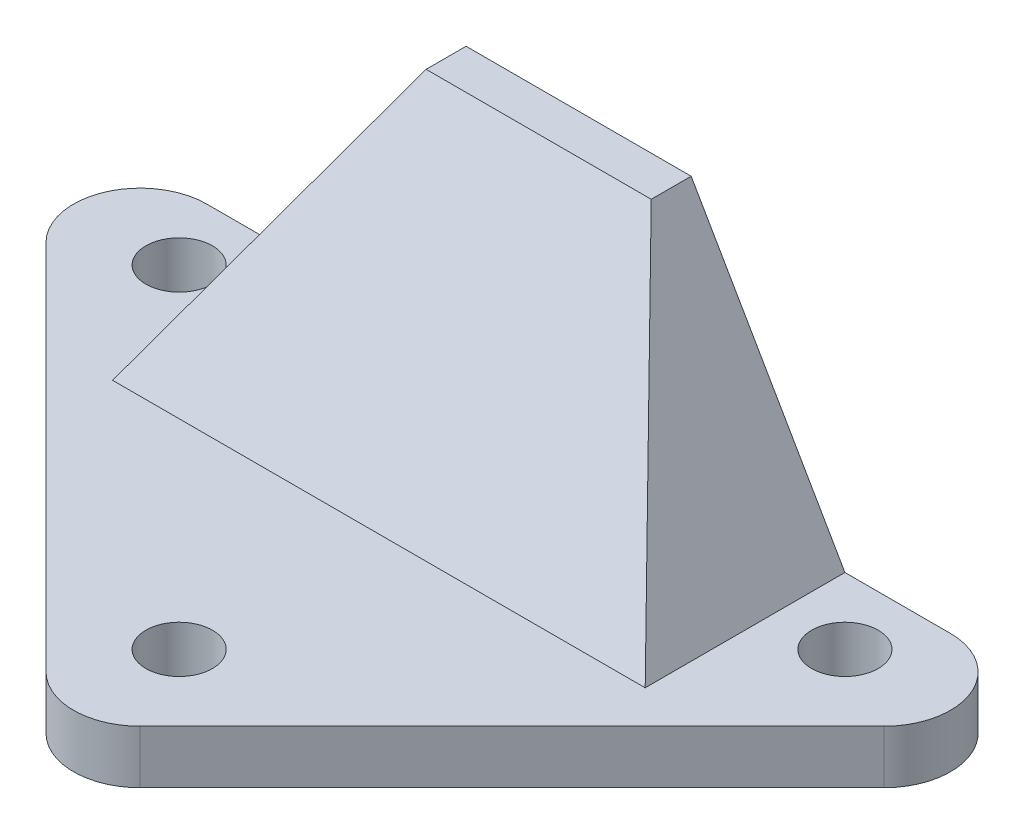
ISO-10303-21;
HEADER;
FILE_DESCRIPTION(('STEP AP214'),'2;1');
FILE_NAME('part.step','',(''),(''),'','','');
FILE_SCHEMA(('AUTOMOTIVE_DESIGN { 1 0 10303 214 1 1 1 1 }'));
ENDSEC;
DATA;
#1=APPLICATION_CONTEXT('core data for automotive mechanical design processes');
#2=APPLICATION_PROTOCOL_DEFINITION('international standard','automotive_design',2000,#1);
#3=PRODUCT_CONTEXT('',#1,'mechanical');
#4=PRODUCT('Part','Part','',(#3));
#5=PRODUCT_RELATED_PRODUCT_CATEGORY('part','',(#4));
#6=PRODUCT_DEFINITION_FORMATION('','',#4);
#7=PRODUCT_DEFINITION_CONTEXT('part definition',#1,'design');
#8=PRODUCT_DEFINITION('design','',#6,#7);
#9=PRODUCT_DEFINITION_SHAPE('','',#8);
#10=(LENGTH_UNIT() NAMED_UNIT(*) SI_UNIT(.MILLI.,.METRE.));
#11=(NAMED_UNIT(*) PLANE_ANGLE_UNIT() SI_UNIT($,.RADIAN.));
#12=(NAMED_UNIT(*) SI_UNIT($,.STERADIAN.) SOLID_ANGLE_UNIT());
#13=UNCERTAINTY_MEASURE_WITH_UNIT(LENGTH_MEASURE(1.E-05),#10,'distance_accuracy_value','');
#14=(GEOMETRIC_REPRESENTATION_CONTEXT(3) GLOBAL_UNCERTAINTY_ASSIGNED_CONTEXT((#13)) GLOBAL_UNIT_ASSIGNED_CONTEXT((#10,
#11,#12)) REPRESENTATION_CONTEXT('',''));
#15=CARTESIAN_POINT('',(0.,0.,0.));
#16=DIRECTION('',(0.,0.,1.));
#17=DIRECTION('',(1.,0.,0.));
#18=AXIS2_PLACEMENT_3D('',#15,#16,#17);
#19=CARTESIAN_POINT('',(0.,4.,37.8762162895045));
#20=DIRECTION('',(0.,-1.,0.));
#21=DIRECTION('',(0.,0.,-1.));
#22=AXIS2_PLACEMENT_3D('',#19,#20,#21);
#23=PLANE('',#22);
#24=CARTESIAN_POINT('',(25.,4.,9.94728410136999));
#25=DIRECTION('',(0.,1.,0.));
#26=DIRECTION('',(0.,0.,1.));
#27=AXIS2_PLACEMENT_3D('',#24,#25,#26);
#28=CIRCLE('',#27,2.5);
#29=CARTESIAN_POINT('',(25.,4.,12.44728410137));
#30=VERTEX_POINT('',#29);
#31=EDGE_CURVE('E293',#30,#30,#28,.T.);
#32=ORIENTED_EDGE('',*,*,#31,.F.);
#33=EDGE_LOOP('',(#32));
#34=FACE_BOUND('',#33,.T.);
#35=DIRECTION('',(0.,0.,-1.));
#36=VECTOR('',#35,1.);
#37=CARTESIAN_POINT('',(20.,4.,19.94728410137));
#38=LINE('',#37,#36);
#39=CARTESIAN_POINT('',(20.,4.,19.94728410137));
#40=VERTEX_POINT('',#39);
#41=CARTESIAN_POINT('',(20.,4.,4.94728410136999));
#42=VERTEX_POINT('',#41);
#43=EDGE_CURVE('E159',#40,#42,#38,.T.);
#44=ORIENTED_EDGE('',*,*,#43,.F.);
#45=DIRECTION('',(-1.,0.,0.));
#46=VECTOR('',#45,1.);
#47=CARTESIAN_POINT('',(-20.,4.,19.94728410137));
#48=LINE('',#47,#46);
#49=CARTESIAN_POINT('',(-20.,4.,19.94728410137));
#50=VERTEX_POINT('',#49);
#51=EDGE_CURVE('E161',#40,#50,#48,.T.);
#52=ORIENTED_EDGE('',*,*,#51,.T.);
#53=DIRECTION('',(0.,0.,-1.));
#54=VECTOR('',#53,1.);
#55=CARTESIAN_POINT('',(-20.,4.,19.94728410137));
#56=LINE('',#55,#54);
#57=CARTESIAN_POINT('',(-20.,4.,4.94728410136999));
#58=VERTEX_POINT('',#57);
#59=EDGE_CURVE('E151',#50,#58,#56,.T.);
#60=ORIENTED_EDGE('',*,*,#59,.T.);
#61=DIRECTION('',(-1.,0.,0.));
#62=VECTOR('',#61,1.);
#63=CARTESIAN_POINT('',(-27.9289321881344,4.,4.94728410136999));
#64=LINE('',#63,#62);
#65=CARTESIAN_POINT('',(-27.9289321881344,4.,4.94728410136999));
#66=VERTEX_POINT('',#65);
#67=EDGE_CURVE('E258',#58,#66,#64,.T.);
#68=ORIENTED_EDGE('',*,*,#67,.T.);
#69=CARTESIAN_POINT('',(-27.9289321881345,4.,9.94728410136999));
#70=DIRECTION('',(0.,1.,0.));
#71=DIRECTION('',(0.,0.,1.));
#72=AXIS2_PLACEMENT_3D('',#69,#70,#71);
#73=CIRCLE('',#72,5.);
#74=CARTESIAN_POINT('',(-31.4644660940672,4.,13.4828180073028));
#75=VERTEX_POINT('',#74);
#76=EDGE_CURVE('E257',#66,#75,#73,.T.);
#77=ORIENTED_EDGE('',*,*,#76,.T.);
#78=DIRECTION('',(0.707106781186547,0.,0.707106781186548));
#79=VECTOR('',#78,1.);
#80=CARTESIAN_POINT('',(-3.53553390593276,4.,41.4117501954372));
#81=LINE('',#80,#79);
#82=CARTESIAN_POINT('',(-3.53553390593276,4.,41.4117501954372));
#83=VERTEX_POINT('',#82);
#84=EDGE_CURVE('E244',#75,#83,#81,.T.);
#85=ORIENTED_EDGE('',*,*,#84,.T.);
#86=CARTESIAN_POINT('',(0.,4.,37.8762162895045));
#87=DIRECTION('',(0.,1.,0.));
#88=DIRECTION('',(0.,0.,-1.));
#89=AXIS2_PLACEMENT_3D('',#86,#87,#88);
#90=CIRCLE('',#89,5.);
#91=CARTESIAN_POINT('',(3.53553390593276,4.,41.4117501954372));
#92=VERTEX_POINT('',#91);
#93=EDGE_CURVE('E239',#83,#92,#90,.T.);
#94=ORIENTED_EDGE('',*,*,#93,.T.);
#95=DIRECTION('',(0.707106781186548,0.,-0.707106781186547));
#96=VECTOR('',#95,1.);
#97=CARTESIAN_POINT('',(31.4644660940672,4.,13.4828180073028));
#98=LINE('',#97,#96);
#99=CARTESIAN_POINT('',(31.4644660940672,4.,13.4828180073028));
#100=VERTEX_POINT('',#99);
#101=EDGE_CURVE('E287',#92,#100,#98,.T.);
#102=ORIENTED_EDGE('',*,*,#101,.T.);
#103=CARTESIAN_POINT('',(27.9289321881345,4.,9.94728410136999));
#104=DIRECTION('',(0.,1.,0.));
#105=DIRECTION('',(0.,0.,-1.));
#106=AXIS2_PLACEMENT_3D('',#103,#104,#105);
#107=CIRCLE('',#106,5.);
#108=CARTESIAN_POINT('',(27.9289321881344,4.,4.94728410136999));
#109=VERTEX_POINT('',#108);
#110=EDGE_CURVE('E262',#100,#109,#107,.T.);
#111=ORIENTED_EDGE('',*,*,#110,.T.);
#112=EDGE_CURVE('E254',#109,#42,#64,.T.);
#113=ORIENTED_EDGE('',*,*,#112,.T.);
#114=EDGE_LOOP('',(#44,#52,#60,#68,#77,#85,#94,#102,#111,#113));
#115=FACE_BOUND('',#114,.T.);
#116=CARTESIAN_POINT('',(0.,4.,34.94728410137));
#117=DIRECTION('',(0.,1.,0.));
#118=DIRECTION('',(0.,0.,1.));
#119=AXIS2_PLACEMENT_3D('',#116,#117,#118);
#120=CIRCLE('',#119,2.5);
#121=CARTESIAN_POINT('',(0.,4.,37.44728410137));
#122=VERTEX_POINT('',#121);
#123=EDGE_CURVE('E167',#122,#122,#120,.T.);
#124=ORIENTED_EDGE('',*,*,#123,.F.);
#125=EDGE_LOOP('',(#124));
#126=FACE_BOUND('',#125,.T.);
#127=CARTESIAN_POINT('',(-25.,4.,9.94728410136999));
#128=DIRECTION('',(0.,1.,0.));
#129=DIRECTION('',(0.,0.,1.));
#130=AXIS2_PLACEMENT_3D('',#127,#128,#129);
#131=CIRCLE('',#130,2.5);
#132=CARTESIAN_POINT('',(-25.,4.,12.44728410137));
#133=VERTEX_POINT('',#132);
#134=EDGE_CURVE('E269',#133,#133,#131,.T.);
#135=ORIENTED_EDGE('',*,*,#134,.F.);
#136=EDGE_LOOP('',(#135));
#137=FACE_BOUND('',#136,.T.);
#138=ADVANCED_FACE('F34',(#34,#115,#126,#137),#23,.F.);
#139=CARTESIAN_POINT('',(0.,0.,37.8762162895045));
#140=DIRECTION('',(0.,-1.,0.));
#141=DIRECTION('',(0.,0.,-1.));
#142=AXIS2_PLACEMENT_3D('',#139,#140,#141);
#143=PLANE('',#142);
#144=DIRECTION('',(0.,0.,-1.));
#145=VECTOR('',#144,1.);
#146=CARTESIAN_POINT('',(14.,0.,12.94728410137));
#147=LINE('',#146,#145);
#148=CARTESIAN_POINT('',(14.,0.,12.94728410137));
#149=VERTEX_POINT('',#148);
#150=CARTESIAN_POINT('',(14.,0.,4.94728410136999));
#151=VERTEX_POINT('',#150);
#152=EDGE_CURVE('E185',#149,#151,#147,.T.);
#153=ORIENTED_EDGE('',*,*,#152,.T.);
#154=DIRECTION('',(-1.,0.,0.));
#155=VECTOR('',#154,1.);
#156=CARTESIAN_POINT('',(-27.9289321881344,0.,4.94728410136999));
#157=LINE('',#156,#155);
#158=CARTESIAN_POINT('',(27.9289321881344,0.,4.94728410136999));
#159=VERTEX_POINT('',#158);
#160=EDGE_CURVE('E229',#159,#151,#157,.T.);
#161=ORIENTED_EDGE('',*,*,#160,.F.);
#162=CARTESIAN_POINT('',(27.9289321881345,0.,9.94728410136999));
#163=DIRECTION('',(0.,1.,0.));
#164=DIRECTION('',(0.,0.,-1.));
#165=AXIS2_PLACEMENT_3D('',#162,#163,#164);
#166=CIRCLE('',#165,5.);
#167=CARTESIAN_POINT('',(31.4644660940672,0.,13.4828180073028));
#168=VERTEX_POINT('',#167);
#169=EDGE_CURVE('E230',#168,#159,#166,.T.);
#170=ORIENTED_EDGE('',*,*,#169,.F.);
#171=DIRECTION('',(0.707106781186548,0.,-0.707106781186547));
#172=VECTOR('',#171,1.);
#173=CARTESIAN_POINT('',(31.4644660940672,0.,13.4828180073028));
#174=LINE('',#173,#172);
#175=CARTESIAN_POINT('',(3.53553390593276,0.,41.4117501954372));
#176=VERTEX_POINT('',#175);
#177=EDGE_CURVE('E232',#176,#168,#174,.T.);
#178=ORIENTED_EDGE('',*,*,#177,.F.);
#179=CARTESIAN_POINT('',(0.,0.,37.8762162895045));
#180=DIRECTION('',(0.,1.,0.));
#181=DIRECTION('',(0.,0.,-1.));
#182=AXIS2_PLACEMENT_3D('',#179,#180,#181);
#183=CIRCLE('',#182,5.);
#184=CARTESIAN_POINT('',(-3.53553390593276,0.,41.4117501954372));
#185=VERTEX_POINT('',#184);
#186=EDGE_CURVE('E267',#185,#176,#183,.T.);
#187=ORIENTED_EDGE('',*,*,#186,.F.);
#188=DIRECTION('',(0.707106781186547,0.,0.707106781186548));
#189=VECTOR('',#188,1.);
#190=CARTESIAN_POINT('',(-3.53553390593276,0.,41.4117501954372));
#191=LINE('',#190,#189);
#192=CARTESIAN_POINT('',(-31.4644660940672,0.,13.4828180073028));
#193=VERTEX_POINT('',#192);
#194=EDGE_CURVE('E237',#193,#185,#191,.T.);
#195=ORIENTED_EDGE('',*,*,#194,.F.);
#196=CARTESIAN_POINT('',(-27.9289321881345,0.,9.94728410136999));
#197=DIRECTION('',(0.,1.,0.));
#198=DIRECTION('',(0.,0.,1.));
#199=AXIS2_PLACEMENT_3D('',#196,#197,#198);
#200=CIRCLE('',#199,5.);
#201=CARTESIAN_POINT('',(-27.9289321881344,0.,4.94728410136999));
#202=VERTEX_POINT('',#201);
#203=EDGE_CURVE('E226',#202,#193,#200,.T.);
#204=ORIENTED_EDGE('',*,*,#203,.F.);
#205=CARTESIAN_POINT('',(-14.,0.,4.94728410136999));
#206=VERTEX_POINT('',#205);
#207=EDGE_CURVE('E224',#206,#202,#157,.T.);
#208=ORIENTED_EDGE('',*,*,#207,.F.);
#209=DIRECTION('',(0.,0.,-1.));
#210=VECTOR('',#209,1.);
#211=CARTESIAN_POINT('',(-14.,0.,12.94728410137));
#212=LINE('',#211,#210);
#213=CARTESIAN_POINT('',(-14.,0.,12.94728410137));
#214=VERTEX_POINT('',#213);
#215=EDGE_CURVE('E51',#214,#206,#212,.T.);
#216=ORIENTED_EDGE('',*,*,#215,.F.);
#217=DIRECTION('',(-1.,0.,0.));
#218=VECTOR('',#217,1.);
#219=CARTESIAN_POINT('',(14.,0.,12.94728410137));
#220=LINE('',#219,#218);
#221=EDGE_CURVE('E206',#149,#214,#220,.T.);
#222=ORIENTED_EDGE('',*,*,#221,.F.);
#223=EDGE_LOOP('',(#153,#161,#170,#178,#187,#195,#204,#208,#216,#222));
#224=FACE_BOUND('',#223,.T.);
#225=CARTESIAN_POINT('',(25.,0.,9.94728410136999));
#226=DIRECTION('',(0.,1.,0.));
#227=DIRECTION('',(0.,0.,1.));
#228=AXIS2_PLACEMENT_3D('',#225,#226,#227);
#229=CIRCLE('',#228,2.5);
#230=CARTESIAN_POINT('',(25.,0.,12.44728410137));
#231=VERTEX_POINT('',#230);
#232=EDGE_CURVE('E296',#231,#231,#229,.T.);
#233=ORIENTED_EDGE('',*,*,#232,.T.);
#234=EDGE_LOOP('',(#233));
#235=FACE_BOUND('',#234,.T.);
#236=CARTESIAN_POINT('',(-25.,0.,9.94728410136999));
#237=DIRECTION('',(0.,1.,0.));
#238=DIRECTION('',(0.,0.,1.));
#239=AXIS2_PLACEMENT_3D('',#236,#237,#238);
#240=CIRCLE('',#239,2.5);
#241=CARTESIAN_POINT('',(-25.,0.,12.44728410137));
#242=VERTEX_POINT('',#241);
#243=EDGE_CURVE('E290',#242,#242,#240,.T.);
#244=ORIENTED_EDGE('',*,*,#243,.T.);
#245=EDGE_LOOP('',(#244));
#246=FACE_BOUND('',#245,.T.);
#247=CARTESIAN_POINT('',(0.,0.,34.94728410137));
#248=DIRECTION('',(0.,1.,0.));
#249=DIRECTION('',(0.,0.,1.));
#250=AXIS2_PLACEMENT_3D('',#247,#248,#249);
#251=CIRCLE('',#250,2.5);
#252=CARTESIAN_POINT('',(0.,0.,37.44728410137));
#253=VERTEX_POINT('',#252);
#254=EDGE_CURVE('E174',#253,#253,#251,.T.);
#255=ORIENTED_EDGE('',*,*,#254,.T.);
#256=EDGE_LOOP('',(#255));
#257=FACE_BOUND('',#256,.T.);
#258=ADVANCED_FACE('F218',(#224,#235,#246,#257),#143,.T.);
#259=CARTESIAN_POINT('',(0.,4.,37.8762162895045));
#260=DIRECTION('',(0.,-1.,0.));
#261=DIRECTION('',(0.,0.,-1.));
#262=AXIS2_PLACEMENT_3D('',#259,#260,#261);
#263=CYLINDRICAL_SURFACE('',#262,5.);
#264=ORIENTED_EDGE('',*,*,#186,.T.);
#265=DIRECTION('',(0.,-1.,0.));
#266=VECTOR('',#265,1.);
#267=CARTESIAN_POINT('',(3.53553390593276,4.,41.4117501954372));
#268=LINE('',#267,#266);
#269=EDGE_CURVE('E11',#92,#176,#268,.T.);
#270=ORIENTED_EDGE('',*,*,#269,.F.);
#271=ORIENTED_EDGE('',*,*,#93,.F.);
#272=DIRECTION('',(0.,-1.,0.));
#273=VECTOR('',#272,1.);
#274=CARTESIAN_POINT('',(-3.53553390593276,4.,41.4117501954372));
#275=LINE('',#274,#273);
#276=EDGE_CURVE('E240',#83,#185,#275,.T.);
#277=ORIENTED_EDGE('',*,*,#276,.T.);
#278=EDGE_LOOP('',(#264,#270,#271,#277));
#279=FACE_BOUND('',#278,.T.);
#280=ADVANCED_FACE('F36',(#279),#263,.T.);
#281=CARTESIAN_POINT('',(31.4644660940672,4.,13.4828180073028));
#282=DIRECTION('',(-0.707106781186547,0.,-0.707106781186548));
#283=DIRECTION('',(-0.707106781186548,0.,0.707106781186547));
#284=AXIS2_PLACEMENT_3D('',#281,#282,#283);
#285=PLANE('',#284);
#286=ORIENTED_EDGE('',*,*,#177,.T.);
#287=DIRECTION('',(0.,-1.,0.));
#288=VECTOR('',#287,1.);
#289=CARTESIAN_POINT('',(31.4644660940672,4.,13.4828180073028));
#290=LINE('',#289,#288);
#291=EDGE_CURVE('E43',#100,#168,#290,.T.);
#292=ORIENTED_EDGE('',*,*,#291,.F.);
#293=ORIENTED_EDGE('',*,*,#101,.F.);
#294=ORIENTED_EDGE('',*,*,#269,.T.);
#295=EDGE_LOOP('',(#286,#292,#293,#294));
#296=FACE_BOUND('',#295,.T.);
#297=ADVANCED_FACE('F272',(#296),#285,.F.);
#298=CARTESIAN_POINT('',(27.9289321881345,4.,9.94728410136999));
#299=DIRECTION('',(0.,-1.,0.));
#300=DIRECTION('',(0.,0.,-1.));
#301=AXIS2_PLACEMENT_3D('',#298,#299,#300);
#302=CYLINDRICAL_SURFACE('',#301,5.);
#303=ORIENTED_EDGE('',*,*,#169,.T.);
#304=DIRECTION('',(0.,-1.,0.));
#305=VECTOR('',#304,1.);
#306=CARTESIAN_POINT('',(27.9289321881344,4.,4.94728410136999));
#307=LINE('',#306,#305);
#308=EDGE_CURVE('E249',#109,#159,#307,.T.);
#309=ORIENTED_EDGE('',*,*,#308,.F.);
#310=ORIENTED_EDGE('',*,*,#110,.F.);
#311=ORIENTED_EDGE('',*,*,#291,.T.);
#312=EDGE_LOOP('',(#303,#309,#310,#311));
#313=FACE_BOUND('',#312,.T.);
#314=ADVANCED_FACE('F278',(#313),#302,.T.);
#315=CARTESIAN_POINT('',(-27.9289321881344,4.,4.94728410136999));
#316=DIRECTION('',(0.,0.,1.));
#317=DIRECTION('',(1.,0.,0.));
#318=AXIS2_PLACEMENT_3D('',#315,#316,#317);
#319=PLANE('',#318);
#320=ORIENTED_EDGE('',*,*,#160,.T.);
#321=DIRECTION('',(0.,-1.,0.));
#322=VECTOR('',#321,1.);
#323=CARTESIAN_POINT('',(14.,0.,4.94728410136999));
#324=LINE('',#323,#322);
#325=CARTESIAN_POINT('',(14.,4.,4.94728410136999));
#326=VERTEX_POINT('',#325);
#327=EDGE_CURVE('E199',#326,#151,#324,.T.);
#328=ORIENTED_EDGE('',*,*,#327,.F.);
#329=DIRECTION('',(1.,0.,0.));
#330=VECTOR('',#329,1.);
#331=CARTESIAN_POINT('',(14.,4.,4.94728410136999));
#332=LINE('',#331,#330);
#333=CARTESIAN_POINT('',(-14.,4.,4.94728410136999));
#334=VERTEX_POINT('',#333);
#335=EDGE_CURVE('E193',#334,#326,#332,.T.);
#336=ORIENTED_EDGE('',*,*,#335,.F.);
#337=DIRECTION('',(0.,1.,0.));
#338=VECTOR('',#337,1.);
#339=CARTESIAN_POINT('',(-14.,0.,4.94728410136999));
#340=LINE('',#339,#338);
#341=EDGE_CURVE('E197',#206,#334,#340,.T.);
#342=ORIENTED_EDGE('',*,*,#341,.F.);
#343=ORIENTED_EDGE('',*,*,#207,.T.);
#344=DIRECTION('',(0.,-1.,0.));
#345=VECTOR('',#344,1.);
#346=CARTESIAN_POINT('',(-27.9289321881344,4.,4.94728410136999));
#347=LINE('',#346,#345);
#348=EDGE_CURVE('E247',#66,#202,#347,.T.);
#349=ORIENTED_EDGE('',*,*,#348,.F.);
#350=ORIENTED_EDGE('',*,*,#67,.F.);
#351=DIRECTION('',(0.500000000000004,0.866025403784436,0.));
#352=VECTOR('',#351,1.);
#353=CARTESIAN_POINT('',(-8.45299461620735,24.,4.94728410136999));
#354=LINE('',#353,#352);
#355=CARTESIAN_POINT('',(-8.45299461620735,24.,4.94728410136999));
#356=VERTEX_POINT('',#355);
#357=EDGE_CURVE('E59',#58,#356,#354,.T.);
#358=ORIENTED_EDGE('',*,*,#357,.T.);
#359=DIRECTION('',(1.,0.,0.));
#360=VECTOR('',#359,1.);
#361=CARTESIAN_POINT('',(8.45299461620737,24.,4.94728410136999));
#362=LINE('',#361,#360);
#363=CARTESIAN_POINT('',(8.45299461620737,24.,4.94728410136999));
#364=VERTEX_POINT('',#363);
#365=EDGE_CURVE('E156',#356,#364,#362,.T.);
#366=ORIENTED_EDGE('',*,*,#365,.T.);
#367=DIRECTION('',(0.500000000000004,-0.866025403784436,0.));
#368=VECTOR('',#367,1.);
#369=CARTESIAN_POINT('',(20.,4.,4.94728410136999));
#370=LINE('',#369,#368);
#371=EDGE_CURVE('E176',#364,#42,#370,.T.);
#372=ORIENTED_EDGE('',*,*,#371,.T.);
#373=ORIENTED_EDGE('',*,*,#112,.F.);
#374=ORIENTED_EDGE('',*,*,#308,.T.);
#375=EDGE_LOOP('',(#320,#328,#336,#342,#343,#349,#350,#358,#366,#372,#373,#374));
#376=FACE_BOUND('',#375,.T.);
#377=ADVANCED_FACE('F281',(#376),#319,.F.);
#378=CARTESIAN_POINT('',(-27.9289321881345,4.,9.94728410136999));
#379=DIRECTION('',(0.,-1.,0.));
#380=DIRECTION('',(0.,0.,-1.));
#381=AXIS2_PLACEMENT_3D('',#378,#379,#380);
#382=CYLINDRICAL_SURFACE('',#381,5.);
#383=ORIENTED_EDGE('',*,*,#203,.T.);
#384=DIRECTION('',(0.,-1.,0.));
#385=VECTOR('',#384,1.);
#386=CARTESIAN_POINT('',(-31.4644660940672,4.,13.4828180073028));
#387=LINE('',#386,#385);
#388=EDGE_CURVE('E243',#75,#193,#387,.T.);
#389=ORIENTED_EDGE('',*,*,#388,.F.);
#390=ORIENTED_EDGE('',*,*,#76,.F.);
#391=ORIENTED_EDGE('',*,*,#348,.T.);
#392=EDGE_LOOP('',(#383,#389,#390,#391));
#393=FACE_BOUND('',#392,.T.);
#394=ADVANCED_FACE('F331',(#393),#382,.T.);
#395=CARTESIAN_POINT('',(-3.53553390593276,4.,41.4117501954372));
#396=DIRECTION('',(0.707106781186548,0.,-0.707106781186547));
#397=DIRECTION('',(-0.707106781186547,0.,-0.707106781186548));
#398=AXIS2_PLACEMENT_3D('',#395,#396,#397);
#399=PLANE('',#398);
#400=ORIENTED_EDGE('',*,*,#194,.T.);
#401=ORIENTED_EDGE('',*,*,#276,.F.);
#402=ORIENTED_EDGE('',*,*,#84,.F.);
#403=ORIENTED_EDGE('',*,*,#388,.T.);
#404=EDGE_LOOP('',(#400,#401,#402,#403));
#405=FACE_BOUND('',#404,.T.);
#406=ADVANCED_FACE('F318',(#405),#399,.F.);
#407=CARTESIAN_POINT('',(-25.,4.,9.94728410136999));
#408=DIRECTION('',(0.,-1.,0.));
#409=DIRECTION('',(0.,0.,-1.));
#410=AXIS2_PLACEMENT_3D('',#407,#408,#409);
#411=CYLINDRICAL_SURFACE('',#410,2.5);
#412=ORIENTED_EDGE('',*,*,#134,.T.);
#413=EDGE_LOOP('',(#412));
#414=FACE_BOUND('',#413,.T.);
#415=ORIENTED_EDGE('',*,*,#243,.F.);
#416=EDGE_LOOP('',(#415));
#417=FACE_BOUND('',#416,.T.);
#418=ADVANCED_FACE('F314',(#414,#417),#411,.F.);
#419=CARTESIAN_POINT('',(25.,4.,9.94728410136999));
#420=DIRECTION('',(0.,-1.,0.));
#421=DIRECTION('',(0.,0.,-1.));
#422=AXIS2_PLACEMENT_3D('',#419,#420,#421);
#423=CYLINDRICAL_SURFACE('',#422,2.5);
#424=ORIENTED_EDGE('',*,*,#31,.T.);
#425=EDGE_LOOP('',(#424));
#426=FACE_BOUND('',#425,.T.);
#427=ORIENTED_EDGE('',*,*,#232,.F.);
#428=EDGE_LOOP('',(#427));
#429=FACE_BOUND('',#428,.T.);
#430=ADVANCED_FACE('F317',(#426,#429),#423,.F.);
#431=CARTESIAN_POINT('',(0.,4.,34.94728410137));
#432=DIRECTION('',(0.,-1.,0.));
#433=DIRECTION('',(0.,0.,-1.));
#434=AXIS2_PLACEMENT_3D('',#431,#432,#433);
#435=CYLINDRICAL_SURFACE('',#434,2.5);
#436=ORIENTED_EDGE('',*,*,#123,.T.);
#437=EDGE_LOOP('',(#436));
#438=FACE_BOUND('',#437,.T.);
#439=ORIENTED_EDGE('',*,*,#254,.F.);
#440=EDGE_LOOP('',(#439));
#441=FACE_BOUND('',#440,.T.);
#442=ADVANCED_FACE('F306',(#438,#441),#435,.F.);
#443=CARTESIAN_POINT('',(20.,4.,19.94728410137));
#444=DIRECTION('',(0.866025403784436,0.500000000000004,0.));
#445=DIRECTION('',(-0.500000000000004,0.866025403784436,0.));
#446=AXIS2_PLACEMENT_3D('',#443,#444,#445);
#447=PLANE('',#446);
#448=DIRECTION('',(-0.443678254708061,0.768473279367838,-0.461083967620703));
#449=VECTOR('',#448,1.);
#450=CARTESIAN_POINT('',(20.,4.,19.94728410137));
#451=LINE('',#450,#449);
#452=CARTESIAN_POINT('',(8.45299461620737,24.,7.94728410136999));
#453=VERTEX_POINT('',#452);
#454=EDGE_CURVE('E143',#40,#453,#451,.T.);
#455=ORIENTED_EDGE('',*,*,#454,.F.);
#456=ORIENTED_EDGE('',*,*,#43,.T.);
#457=ORIENTED_EDGE('',*,*,#371,.F.);
#458=DIRECTION('',(0.,0.,-1.));
#459=VECTOR('',#458,1.);
#460=CARTESIAN_POINT('',(8.45299461620737,24.,19.94728410137));
#461=LINE('',#460,#459);
#462=EDGE_CURVE('E157',#453,#364,#461,.T.);
#463=ORIENTED_EDGE('',*,*,#462,.F.);
#464=EDGE_LOOP('',(#455,#456,#457,#463));
#465=FACE_BOUND('',#464,.T.);
#466=ADVANCED_FACE('F380',(#465),#447,.T.);
#467=CARTESIAN_POINT('',(8.45299461620737,24.,19.94728410137));
#468=DIRECTION('',(0.,1.,0.));
#469=DIRECTION('',(0.,0.,1.));
#470=AXIS2_PLACEMENT_3D('',#467,#468,#469);
#471=PLANE('',#470);
#472=DIRECTION('',(1.,0.,0.));
#473=VECTOR('',#472,1.);
#474=CARTESIAN_POINT('',(-32.9289321881345,24.,7.94728410136999));
#475=LINE('',#474,#473);
#476=CARTESIAN_POINT('',(-8.45299461620735,24.,7.94728410136999));
#477=VERTEX_POINT('',#476);
#478=EDGE_CURVE('E138',#477,#453,#475,.T.);
#479=ORIENTED_EDGE('',*,*,#478,.T.);
#480=ORIENTED_EDGE('',*,*,#462,.T.);
#481=ORIENTED_EDGE('',*,*,#365,.F.);
#482=DIRECTION('',(0.,0.,-1.));
#483=VECTOR('',#482,1.);
#484=CARTESIAN_POINT('',(-8.45299461620735,24.,19.94728410137));
#485=LINE('',#484,#483);
#486=EDGE_CURVE('E149',#477,#356,#485,.T.);
#487=ORIENTED_EDGE('',*,*,#486,.F.);
#488=EDGE_LOOP('',(#479,#480,#481,#487));
#489=FACE_BOUND('',#488,.T.);
#490=ADVANCED_FACE('F154',(#489),#471,.T.);
#491=CARTESIAN_POINT('',(-8.45299461620735,24.,19.94728410137));
#492=DIRECTION('',(-0.866025403784436,0.500000000000004,0.));
#493=DIRECTION('',(-0.500000000000005,-0.866025403784436,0.));
#494=AXIS2_PLACEMENT_3D('',#491,#492,#493);
#495=PLANE('',#494);
#496=DIRECTION('',(-0.443678254708061,-0.768473279367838,0.461083967620703));
#497=VECTOR('',#496,1.);
#498=CARTESIAN_POINT('',(-10.9078697765412,19.748031496063,10.4984652037322));
#499=LINE('',#498,#497);
#500=EDGE_CURVE('E141',#477,#50,#499,.T.);
#501=ORIENTED_EDGE('',*,*,#500,.F.);
#502=ORIENTED_EDGE('',*,*,#486,.T.);
#503=ORIENTED_EDGE('',*,*,#357,.F.);
#504=ORIENTED_EDGE('',*,*,#59,.F.);
#505=EDGE_LOOP('',(#501,#502,#503,#504));
#506=FACE_BOUND('',#505,.T.);
#507=ADVANCED_FACE('F148',(#506),#495,.T.);
#508=CARTESIAN_POINT('',(14.,0.,12.94728410137));
#509=DIRECTION('',(1.,0.,0.));
#510=DIRECTION('',(0.,1.,0.));
#511=AXIS2_PLACEMENT_3D('',#508,#509,#510);
#512=PLANE('',#511);
#513=ORIENTED_EDGE('',*,*,#327,.T.);
#514=ORIENTED_EDGE('',*,*,#152,.F.);
#515=DIRECTION('',(0.,-1.,0.));
#516=VECTOR('',#515,1.);
#517=CARTESIAN_POINT('',(14.,0.,12.94728410137));
#518=LINE('',#517,#516);
#519=CARTESIAN_POINT('',(14.,4.,12.94728410137));
#520=VERTEX_POINT('',#519);
#521=EDGE_CURVE('E196',#520,#149,#518,.T.);
#522=ORIENTED_EDGE('',*,*,#521,.F.);
#523=DIRECTION('',(0.,0.,-1.));
#524=VECTOR('',#523,1.);
#525=CARTESIAN_POINT('',(14.,4.,12.94728410137));
#526=LINE('',#525,#524);
#527=EDGE_CURVE('E183',#520,#326,#526,.T.);
#528=ORIENTED_EDGE('',*,*,#527,.T.);
#529=EDGE_LOOP('',(#513,#514,#522,#528));
#530=FACE_BOUND('',#529,.T.);
#531=ADVANCED_FACE('F399',(#530),#512,.F.);
#532=CARTESIAN_POINT('',(14.,4.,12.94728410137));
#533=DIRECTION('',(0.,1.,0.));
#534=DIRECTION('',(0.,0.,1.));
#535=AXIS2_PLACEMENT_3D('',#532,#533,#534);
#536=PLANE('',#535);
#537=ORIENTED_EDGE('',*,*,#335,.T.);
#538=ORIENTED_EDGE('',*,*,#527,.F.);
#539=DIRECTION('',(1.,0.,0.));
#540=VECTOR('',#539,1.);
#541=CARTESIAN_POINT('',(14.,4.,12.94728410137));
#542=LINE('',#541,#540);
#543=CARTESIAN_POINT('',(-14.,4.,12.94728410137));
#544=VERTEX_POINT('',#543);
#545=EDGE_CURVE('E188',#544,#520,#542,.T.);
#546=ORIENTED_EDGE('',*,*,#545,.F.);
#547=DIRECTION('',(0.,0.,-1.));
#548=VECTOR('',#547,1.);
#549=CARTESIAN_POINT('',(-14.,4.,12.94728410137));
#550=LINE('',#549,#548);
#551=EDGE_CURVE('E190',#544,#334,#550,.T.);
#552=ORIENTED_EDGE('',*,*,#551,.T.);
#553=EDGE_LOOP('',(#537,#538,#546,#552));
#554=FACE_BOUND('',#553,.T.);
#555=ADVANCED_FACE('F406',(#554),#536,.F.);
#556=CARTESIAN_POINT('',(-14.,0.,12.94728410137));
#557=DIRECTION('',(-1.,0.,0.));
#558=DIRECTION('',(0.,-1.,0.));
#559=AXIS2_PLACEMENT_3D('',#556,#557,#558);
#560=PLANE('',#559);
#561=ORIENTED_EDGE('',*,*,#341,.T.);
#562=ORIENTED_EDGE('',*,*,#551,.F.);
#563=DIRECTION('',(0.,1.,0.));
#564=VECTOR('',#563,1.);
#565=CARTESIAN_POINT('',(-14.,0.,12.94728410137));
#566=LINE('',#565,#564);
#567=EDGE_CURVE('E203',#214,#544,#566,.T.);
#568=ORIENTED_EDGE('',*,*,#567,.F.);
#569=ORIENTED_EDGE('',*,*,#215,.T.);
#570=EDGE_LOOP('',(#561,#562,#568,#569));
#571=FACE_BOUND('',#570,.T.);
#572=ADVANCED_FACE('F413',(#571),#560,.F.);
#573=CARTESIAN_POINT('',(0.,0.,12.94728410137));
#574=DIRECTION('',(0.,0.,1.));
#575=DIRECTION('',(1.,0.,0.));
#576=AXIS2_PLACEMENT_3D('',#573,#574,#575);
#577=PLANE('',#576);
#578=ORIENTED_EDGE('',*,*,#521,.T.);
#579=ORIENTED_EDGE('',*,*,#221,.T.);
#580=ORIENTED_EDGE('',*,*,#567,.T.);
#581=ORIENTED_EDGE('',*,*,#545,.T.);
#582=EDGE_LOOP('',(#578,#579,#580,#581));
#583=FACE_BOUND('',#582,.T.);
#584=ADVANCED_FACE('F214',(#583),#577,.F.);
#585=CARTESIAN_POINT('',(-32.9289321881345,24.,7.94728410136999));
#586=DIRECTION('',(0.,-0.514495755427526,-0.857492925712544));
#587=DIRECTION('',(0.,0.857492925712544,-0.514495755427527));
#588=AXIS2_PLACEMENT_3D('',#585,#586,#587);
#589=PLANE('',#588);
#590=ORIENTED_EDGE('',*,*,#454,.T.);
#591=ORIENTED_EDGE('',*,*,#478,.F.);
#592=ORIENTED_EDGE('',*,*,#500,.T.);
#593=ORIENTED_EDGE('',*,*,#51,.F.);
#594=EDGE_LOOP('',(#590,#591,#592,#593));
#595=FACE_BOUND('',#594,.T.);
#596=ADVANCED_FACE('F140',(#595),#589,.F.);
#597=CLOSED_SHELL('',(#138,#258,#280,#297,#314,#377,#394,#406,#418,#430,#442,#466,#490,#507,
#531,#555,#572,#584,#596));
#598=MANIFOLD_SOLID_BREP('B2',#597);
#599=ADVANCED_BREP_SHAPE_REPRESENTATION('',(#18,#598),#14);
#600=SHAPE_DEFINITION_REPRESENTATION(#9,#599);
ENDSEC;
END-ISO-10303-21;
